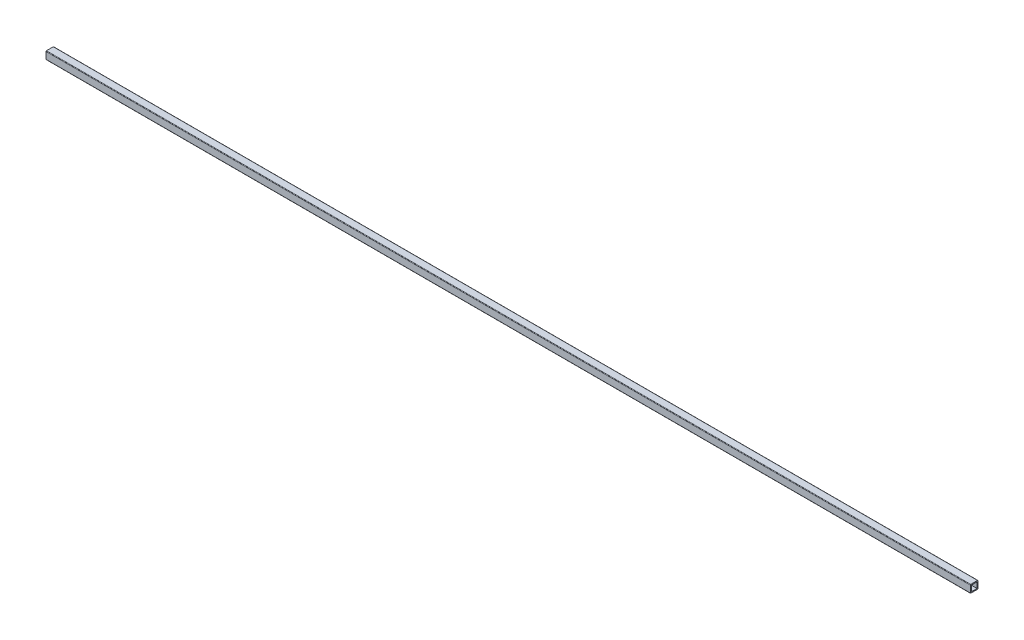
ISO-10303-21;
HEADER;
FILE_DESCRIPTION(('STEP AP214'),'2;1');
FILE_NAME('part.step','',(''),(''),'','','');
FILE_SCHEMA(('AUTOMOTIVE_DESIGN { 1 0 10303 214 1 1 1 1 }'));
ENDSEC;
DATA;
#1=APPLICATION_CONTEXT('core data for automotive mechanical design processes');
#2=APPLICATION_PROTOCOL_DEFINITION('international standard','automotive_design',2000,#1);
#3=PRODUCT_CONTEXT('',#1,'mechanical');
#4=PRODUCT('Part','Part','',(#3));
#5=PRODUCT_RELATED_PRODUCT_CATEGORY('part','',(#4));
#6=PRODUCT_DEFINITION_FORMATION('','',#4);
#7=PRODUCT_DEFINITION_CONTEXT('part definition',#1,'design');
#8=PRODUCT_DEFINITION('design','',#6,#7);
#9=PRODUCT_DEFINITION_SHAPE('','',#8);
#10=(LENGTH_UNIT() NAMED_UNIT(*) SI_UNIT(.MILLI.,.METRE.));
#11=(NAMED_UNIT(*) PLANE_ANGLE_UNIT() SI_UNIT($,.RADIAN.));
#12=(NAMED_UNIT(*) SI_UNIT($,.STERADIAN.) SOLID_ANGLE_UNIT());
#13=UNCERTAINTY_MEASURE_WITH_UNIT(LENGTH_MEASURE(1.E-05),#10,'distance_accuracy_value','');
#14=(GEOMETRIC_REPRESENTATION_CONTEXT(3) GLOBAL_UNCERTAINTY_ASSIGNED_CONTEXT((#13)) GLOBAL_UNIT_ASSIGNED_CONTEXT((#10,
#11,#12)) REPRESENTATION_CONTEXT('',''));
#15=CARTESIAN_POINT('',(0.,0.,0.));
#16=DIRECTION('',(0.,0.,1.));
#17=DIRECTION('',(1.,0.,0.));
#18=AXIS2_PLACEMENT_3D('',#15,#16,#17);
#19=CARTESIAN_POINT('',(1524.,-5.55625,-5.55625));
#20=DIRECTION('',(-1.,0.,0.));
#21=DIRECTION('',(0.,0.,1.));
#22=AXIS2_PLACEMENT_3D('',#19,#20,#21);
#23=CYLINDRICAL_SURFACE('',#22,0.79375);
#24=CARTESIAN_POINT('',(0.,-5.55625,-5.55625));
#25=DIRECTION('',(1.,0.,0.));
#26=DIRECTION('',(0.,0.,-1.));
#27=AXIS2_PLACEMENT_3D('',#24,#25,#26);
#28=CIRCLE('',#27,0.79375);
#29=CARTESIAN_POINT('',(0.,-6.35,-5.55624999999999));
#30=VERTEX_POINT('',#29);
#31=CARTESIAN_POINT('',(0.,-5.55624999999999,-6.35));
#32=VERTEX_POINT('',#31);
#33=EDGE_CURVE('E195',#30,#32,#28,.T.);
#34=ORIENTED_EDGE('',*,*,#33,.T.);
#35=DIRECTION('',(-1.,0.,0.));
#36=VECTOR('',#35,1.);
#37=CARTESIAN_POINT('',(1524.,-5.55624999999999,-6.35));
#38=LINE('',#37,#36);
#39=CARTESIAN_POINT('',(1524.,-5.55624999999999,-6.35));
#40=VERTEX_POINT('',#39);
#41=EDGE_CURVE('E12',#40,#32,#38,.T.);
#42=ORIENTED_EDGE('',*,*,#41,.F.);
#43=CARTESIAN_POINT('',(1524.,-5.55625,-5.55625));
#44=DIRECTION('',(1.,0.,0.));
#45=DIRECTION('',(0.,0.,-1.));
#46=AXIS2_PLACEMENT_3D('',#43,#44,#45);
#47=CIRCLE('',#46,0.79375);
#48=CARTESIAN_POINT('',(1524.,-6.35,-5.55624999999999));
#49=VERTEX_POINT('',#48);
#50=EDGE_CURVE('E248',#49,#40,#47,.T.);
#51=ORIENTED_EDGE('',*,*,#50,.F.);
#52=DIRECTION('',(-1.,0.,0.));
#53=VECTOR('',#52,1.);
#54=CARTESIAN_POINT('',(1524.,-6.35,-5.55624999999999));
#55=LINE('',#54,#53);
#56=EDGE_CURVE('E210',#49,#30,#55,.T.);
#57=ORIENTED_EDGE('',*,*,#56,.T.);
#58=EDGE_LOOP('',(#34,#42,#51,#57));
#59=FACE_BOUND('',#58,.T.);
#60=ADVANCED_FACE('F59',(#59),#23,.T.);
#61=CARTESIAN_POINT('',(1524.,-5.55624999999999,-6.35));
#62=DIRECTION('',(0.,0.,1.));
#63=DIRECTION('',(1.,0.,0.));
#64=AXIS2_PLACEMENT_3D('',#61,#62,#63);
#65=PLANE('',#64);
#66=DIRECTION('',(0.,1.,0.));
#67=VECTOR('',#66,1.);
#68=CARTESIAN_POINT('',(0.,-5.55624999999999,-6.35));
#69=LINE('',#68,#67);
#70=CARTESIAN_POINT('',(0.,5.55625,-6.35));
#71=VERTEX_POINT('',#70);
#72=EDGE_CURVE('E198',#32,#71,#69,.T.);
#73=ORIENTED_EDGE('',*,*,#72,.T.);
#74=DIRECTION('',(-1.,0.,0.));
#75=VECTOR('',#74,1.);
#76=CARTESIAN_POINT('',(1524.,5.55625,-6.35));
#77=LINE('',#76,#75);
#78=CARTESIAN_POINT('',(1524.,5.55625,-6.35));
#79=VERTEX_POINT('',#78);
#80=EDGE_CURVE('E69',#79,#71,#77,.T.);
#81=ORIENTED_EDGE('',*,*,#80,.F.);
#82=DIRECTION('',(0.,1.,0.));
#83=VECTOR('',#82,1.);
#84=CARTESIAN_POINT('',(1524.,-5.55624999999999,-6.35));
#85=LINE('',#84,#83);
#86=EDGE_CURVE('E250',#40,#79,#85,.T.);
#87=ORIENTED_EDGE('',*,*,#86,.F.);
#88=ORIENTED_EDGE('',*,*,#41,.T.);
#89=EDGE_LOOP('',(#73,#81,#87,#88));
#90=FACE_BOUND('',#89,.T.);
#91=ADVANCED_FACE('F285',(#90),#65,.F.);
#92=CARTESIAN_POINT('',(1524.,5.55625,-5.55625));
#93=DIRECTION('',(-1.,0.,0.));
#94=DIRECTION('',(0.,0.,1.));
#95=AXIS2_PLACEMENT_3D('',#92,#93,#94);
#96=CYLINDRICAL_SURFACE('',#95,0.79375);
#97=CARTESIAN_POINT('',(0.,5.55625,-5.55625));
#98=DIRECTION('',(1.,0.,0.));
#99=DIRECTION('',(0.,0.,-1.));
#100=AXIS2_PLACEMENT_3D('',#97,#98,#99);
#101=CIRCLE('',#100,0.79375);
#102=CARTESIAN_POINT('',(0.,6.35,-5.55624999999999));
#103=VERTEX_POINT('',#102);
#104=EDGE_CURVE('E200',#71,#103,#101,.T.);
#105=ORIENTED_EDGE('',*,*,#104,.T.);
#106=DIRECTION('',(-1.,0.,0.));
#107=VECTOR('',#106,1.);
#108=CARTESIAN_POINT('',(1524.,6.35,-5.55624999999999));
#109=LINE('',#108,#107);
#110=CARTESIAN_POINT('',(1524.,6.35,-5.55624999999999));
#111=VERTEX_POINT('',#110);
#112=EDGE_CURVE('E217',#111,#103,#109,.T.);
#113=ORIENTED_EDGE('',*,*,#112,.F.);
#114=CARTESIAN_POINT('',(1524.,5.55625,-5.55625));
#115=DIRECTION('',(1.,0.,0.));
#116=DIRECTION('',(0.,0.,-1.));
#117=AXIS2_PLACEMENT_3D('',#114,#115,#116);
#118=CIRCLE('',#117,0.79375);
#119=EDGE_CURVE('E255',#79,#111,#118,.T.);
#120=ORIENTED_EDGE('',*,*,#119,.F.);
#121=ORIENTED_EDGE('',*,*,#80,.T.);
#122=EDGE_LOOP('',(#105,#113,#120,#121));
#123=FACE_BOUND('',#122,.T.);
#124=ADVANCED_FACE('F290',(#123),#96,.T.);
#125=CARTESIAN_POINT('',(1524.,6.35,5.55625));
#126=DIRECTION('',(0.,-1.,0.));
#127=DIRECTION('',(0.,0.,-1.));
#128=AXIS2_PLACEMENT_3D('',#125,#126,#127);
#129=PLANE('',#128);
#130=DIRECTION('',(0.,0.,1.));
#131=VECTOR('',#130,1.);
#132=CARTESIAN_POINT('',(0.,6.35,5.55625));
#133=LINE('',#132,#131);
#134=CARTESIAN_POINT('',(0.,6.35,5.55625));
#135=VERTEX_POINT('',#134);
#136=EDGE_CURVE('E202',#103,#135,#133,.T.);
#137=ORIENTED_EDGE('',*,*,#136,.T.);
#138=DIRECTION('',(-1.,0.,0.));
#139=VECTOR('',#138,1.);
#140=CARTESIAN_POINT('',(1524.,6.35,5.55625));
#141=LINE('',#140,#139);
#142=CARTESIAN_POINT('',(1524.,6.35,5.55625));
#143=VERTEX_POINT('',#142);
#144=EDGE_CURVE('E214',#143,#135,#141,.T.);
#145=ORIENTED_EDGE('',*,*,#144,.F.);
#146=DIRECTION('',(0.,0.,1.));
#147=VECTOR('',#146,1.);
#148=CARTESIAN_POINT('',(1524.,6.35,5.55625));
#149=LINE('',#148,#147);
#150=EDGE_CURVE('E257',#111,#143,#149,.T.);
#151=ORIENTED_EDGE('',*,*,#150,.F.);
#152=ORIENTED_EDGE('',*,*,#112,.T.);
#153=EDGE_LOOP('',(#137,#145,#151,#152));
#154=FACE_BOUND('',#153,.T.);
#155=ADVANCED_FACE('F263',(#154),#129,.F.);
#156=CARTESIAN_POINT('',(1524.,5.55625,5.55625));
#157=DIRECTION('',(-1.,0.,0.));
#158=DIRECTION('',(0.,0.,1.));
#159=AXIS2_PLACEMENT_3D('',#156,#157,#158);
#160=CYLINDRICAL_SURFACE('',#159,0.79375);
#161=CARTESIAN_POINT('',(0.,5.55625,5.55625));
#162=DIRECTION('',(1.,0.,0.));
#163=DIRECTION('',(0.,0.,1.));
#164=AXIS2_PLACEMENT_3D('',#161,#162,#163);
#165=CIRCLE('',#164,0.79375);
#166=CARTESIAN_POINT('',(0.,5.55624999999999,6.35));
#167=VERTEX_POINT('',#166);
#168=EDGE_CURVE('E204',#135,#167,#165,.T.);
#169=ORIENTED_EDGE('',*,*,#168,.T.);
#170=DIRECTION('',(-1.,0.,0.));
#171=VECTOR('',#170,1.);
#172=CARTESIAN_POINT('',(1524.,5.55624999999999,6.35));
#173=LINE('',#172,#171);
#174=CARTESIAN_POINT('',(1524.,5.55624999999999,6.35));
#175=VERTEX_POINT('',#174);
#176=EDGE_CURVE('E174',#175,#167,#173,.T.);
#177=ORIENTED_EDGE('',*,*,#176,.F.);
#178=CARTESIAN_POINT('',(1524.,5.55625,5.55625));
#179=DIRECTION('',(1.,0.,0.));
#180=DIRECTION('',(0.,0.,1.));
#181=AXIS2_PLACEMENT_3D('',#178,#179,#180);
#182=CIRCLE('',#181,0.79375);
#183=EDGE_CURVE('E165',#143,#175,#182,.T.);
#184=ORIENTED_EDGE('',*,*,#183,.F.);
#185=ORIENTED_EDGE('',*,*,#144,.T.);
#186=EDGE_LOOP('',(#169,#177,#184,#185));
#187=FACE_BOUND('',#186,.T.);
#188=ADVANCED_FACE('F267',(#187),#160,.T.);
#189=CARTESIAN_POINT('',(1524.,-5.55624999999999,6.35));
#190=DIRECTION('',(0.,0.,-1.));
#191=DIRECTION('',(-1.,0.,0.));
#192=AXIS2_PLACEMENT_3D('',#189,#190,#191);
#193=PLANE('',#192);
#194=DIRECTION('',(0.,-1.,0.));
#195=VECTOR('',#194,1.);
#196=CARTESIAN_POINT('',(0.,-5.55624999999999,6.35));
#197=LINE('',#196,#195);
#198=CARTESIAN_POINT('',(0.,-5.55624999999999,6.35));
#199=VERTEX_POINT('',#198);
#200=EDGE_CURVE('E173',#167,#199,#197,.T.);
#201=ORIENTED_EDGE('',*,*,#200,.T.);
#202=DIRECTION('',(-1.,0.,0.));
#203=VECTOR('',#202,1.);
#204=CARTESIAN_POINT('',(1524.,-5.55624999999999,6.35));
#205=LINE('',#204,#203);
#206=CARTESIAN_POINT('',(1524.,-5.55624999999999,6.35));
#207=VERTEX_POINT('',#206);
#208=EDGE_CURVE('E170',#207,#199,#205,.T.);
#209=ORIENTED_EDGE('',*,*,#208,.F.);
#210=DIRECTION('',(0.,-1.,0.));
#211=VECTOR('',#210,1.);
#212=CARTESIAN_POINT('',(1524.,-5.55624999999999,6.35));
#213=LINE('',#212,#211);
#214=EDGE_CURVE('E159',#175,#207,#213,.T.);
#215=ORIENTED_EDGE('',*,*,#214,.F.);
#216=ORIENTED_EDGE('',*,*,#176,.T.);
#217=EDGE_LOOP('',(#201,#209,#215,#216));
#218=FACE_BOUND('',#217,.T.);
#219=ADVANCED_FACE('F171',(#218),#193,.F.);
#220=CARTESIAN_POINT('',(1524.,-5.55625,5.55625));
#221=DIRECTION('',(-1.,0.,0.));
#222=DIRECTION('',(0.,0.,1.));
#223=AXIS2_PLACEMENT_3D('',#220,#221,#222);
#224=CYLINDRICAL_SURFACE('',#223,0.79375);
#225=CARTESIAN_POINT('',(0.,-5.55625,5.55625));
#226=DIRECTION('',(1.,0.,0.));
#227=DIRECTION('',(0.,0.,-1.));
#228=AXIS2_PLACEMENT_3D('',#225,#226,#227);
#229=CIRCLE('',#228,0.79375);
#230=CARTESIAN_POINT('',(0.,-6.35,5.55625));
#231=VERTEX_POINT('',#230);
#232=EDGE_CURVE('E119',#199,#231,#229,.T.);
#233=ORIENTED_EDGE('',*,*,#232,.T.);
#234=DIRECTION('',(-1.,0.,0.));
#235=VECTOR('',#234,1.);
#236=CARTESIAN_POINT('',(1524.,-6.35,5.55625));
#237=LINE('',#236,#235);
#238=CARTESIAN_POINT('',(1524.,-6.35,5.55625));
#239=VERTEX_POINT('',#238);
#240=EDGE_CURVE('E175',#239,#231,#237,.T.);
#241=ORIENTED_EDGE('',*,*,#240,.F.);
#242=CARTESIAN_POINT('',(1524.,-5.55625,5.55625));
#243=DIRECTION('',(1.,0.,0.));
#244=DIRECTION('',(0.,0.,-1.));
#245=AXIS2_PLACEMENT_3D('',#242,#243,#244);
#246=CIRCLE('',#245,0.79375);
#247=EDGE_CURVE('E163',#207,#239,#246,.T.);
#248=ORIENTED_EDGE('',*,*,#247,.F.);
#249=ORIENTED_EDGE('',*,*,#208,.T.);
#250=EDGE_LOOP('',(#233,#241,#248,#249));
#251=FACE_BOUND('',#250,.T.);
#252=ADVANCED_FACE('F177',(#251),#224,.T.);
#253=CARTESIAN_POINT('',(1524.,-4.699,4.699));
#254=DIRECTION('',(0.,0.,-1.));
#255=DIRECTION('',(-1.,0.,0.));
#256=AXIS2_PLACEMENT_3D('',#253,#254,#255);
#257=PLANE('',#256);
#258=DIRECTION('',(0.,-1.,0.));
#259=VECTOR('',#258,1.);
#260=CARTESIAN_POINT('',(0.,-4.699,4.699));
#261=LINE('',#260,#259);
#262=CARTESIAN_POINT('',(0.,4.699,4.699));
#263=VERTEX_POINT('',#262);
#264=CARTESIAN_POINT('',(0.,-4.699,4.699));
#265=VERTEX_POINT('',#264);
#266=EDGE_CURVE('E183',#263,#265,#261,.T.);
#267=ORIENTED_EDGE('',*,*,#266,.F.);
#268=DIRECTION('',(-1.,0.,0.));
#269=VECTOR('',#268,1.);
#270=CARTESIAN_POINT('',(1524.,4.699,4.699));
#271=LINE('',#270,#269);
#272=CARTESIAN_POINT('',(1524.,4.699,4.699));
#273=VERTEX_POINT('',#272);
#274=EDGE_CURVE('E63',#273,#263,#271,.T.);
#275=ORIENTED_EDGE('',*,*,#274,.F.);
#276=DIRECTION('',(0.,-1.,0.));
#277=VECTOR('',#276,1.);
#278=CARTESIAN_POINT('',(1524.,-4.699,4.699));
#279=LINE('',#278,#277);
#280=CARTESIAN_POINT('',(1524.,-4.699,4.699));
#281=VERTEX_POINT('',#280);
#282=EDGE_CURVE('E209',#273,#281,#279,.T.);
#283=ORIENTED_EDGE('',*,*,#282,.T.);
#284=DIRECTION('',(-1.,0.,0.));
#285=VECTOR('',#284,1.);
#286=CARTESIAN_POINT('',(1524.,-4.699,4.699));
#287=LINE('',#286,#285);
#288=EDGE_CURVE('E179',#281,#265,#287,.T.);
#289=ORIENTED_EDGE('',*,*,#288,.T.);
#290=EDGE_LOOP('',(#267,#275,#283,#289));
#291=FACE_BOUND('',#290,.T.);
#292=ADVANCED_FACE('F61',(#291),#257,.T.);
#293=CARTESIAN_POINT('',(1524.,4.699,4.699));
#294=DIRECTION('',(0.,-1.,0.));
#295=DIRECTION('',(0.,0.,-1.));
#296=AXIS2_PLACEMENT_3D('',#293,#294,#295);
#297=PLANE('',#296);
#298=DIRECTION('',(0.,0.,1.));
#299=VECTOR('',#298,1.);
#300=CARTESIAN_POINT('',(0.,4.699,4.699));
#301=LINE('',#300,#299);
#302=CARTESIAN_POINT('',(0.,4.699,-4.699));
#303=VERTEX_POINT('',#302);
#304=EDGE_CURVE('E186',#303,#263,#301,.T.);
#305=ORIENTED_EDGE('',*,*,#304,.F.);
#306=DIRECTION('',(-1.,0.,0.));
#307=VECTOR('',#306,1.);
#308=CARTESIAN_POINT('',(1524.,4.699,-4.699));
#309=LINE('',#308,#307);
#310=CARTESIAN_POINT('',(1524.,4.699,-4.699));
#311=VERTEX_POINT('',#310);
#312=EDGE_CURVE('E224',#311,#303,#309,.T.);
#313=ORIENTED_EDGE('',*,*,#312,.F.);
#314=DIRECTION('',(0.,0.,1.));
#315=VECTOR('',#314,1.);
#316=CARTESIAN_POINT('',(1524.,4.699,4.699));
#317=LINE('',#316,#315);
#318=EDGE_CURVE('E233',#311,#273,#317,.T.);
#319=ORIENTED_EDGE('',*,*,#318,.T.);
#320=ORIENTED_EDGE('',*,*,#274,.T.);
#321=EDGE_LOOP('',(#305,#313,#319,#320));
#322=FACE_BOUND('',#321,.T.);
#323=ADVANCED_FACE('F231',(#322),#297,.T.);
#324=CARTESIAN_POINT('',(1524.,-4.699,-4.699));
#325=DIRECTION('',(0.,0.,1.));
#326=DIRECTION('',(0.,-1.,0.));
#327=AXIS2_PLACEMENT_3D('',#324,#325,#326);
#328=PLANE('',#327);
#329=DIRECTION('',(0.,1.,0.));
#330=VECTOR('',#329,1.);
#331=CARTESIAN_POINT('',(0.,-4.699,-4.699));
#332=LINE('',#331,#330);
#333=CARTESIAN_POINT('',(0.,-4.699,-4.699));
#334=VERTEX_POINT('',#333);
#335=EDGE_CURVE('E189',#334,#303,#332,.T.);
#336=ORIENTED_EDGE('',*,*,#335,.F.);
#337=DIRECTION('',(-1.,0.,0.));
#338=VECTOR('',#337,1.);
#339=CARTESIAN_POINT('',(1524.,-4.699,-4.699));
#340=LINE('',#339,#338);
#341=CARTESIAN_POINT('',(1524.,-4.699,-4.699));
#342=VERTEX_POINT('',#341);
#343=EDGE_CURVE('E223',#342,#334,#340,.T.);
#344=ORIENTED_EDGE('',*,*,#343,.F.);
#345=DIRECTION('',(0.,1.,0.));
#346=VECTOR('',#345,1.);
#347=CARTESIAN_POINT('',(1524.,-4.699,-4.699));
#348=LINE('',#347,#346);
#349=EDGE_CURVE('E240',#342,#311,#348,.T.);
#350=ORIENTED_EDGE('',*,*,#349,.T.);
#351=ORIENTED_EDGE('',*,*,#312,.T.);
#352=EDGE_LOOP('',(#336,#344,#350,#351));
#353=FACE_BOUND('',#352,.T.);
#354=ADVANCED_FACE('F238',(#353),#328,.T.);
#355=CARTESIAN_POINT('',(1524.,-4.699,4.699));
#356=DIRECTION('',(0.,1.,0.));
#357=DIRECTION('',(0.,0.,1.));
#358=AXIS2_PLACEMENT_3D('',#355,#356,#357);
#359=PLANE('',#358);
#360=DIRECTION('',(0.,0.,-1.));
#361=VECTOR('',#360,1.);
#362=CARTESIAN_POINT('',(0.,-4.699,4.699));
#363=LINE('',#362,#361);
#364=EDGE_CURVE('E192',#265,#334,#363,.T.);
#365=ORIENTED_EDGE('',*,*,#364,.F.);
#366=ORIENTED_EDGE('',*,*,#288,.F.);
#367=DIRECTION('',(0.,0.,-1.));
#368=VECTOR('',#367,1.);
#369=CARTESIAN_POINT('',(1524.,-4.699,4.699));
#370=LINE('',#369,#368);
#371=EDGE_CURVE('E245',#281,#342,#370,.T.);
#372=ORIENTED_EDGE('',*,*,#371,.T.);
#373=ORIENTED_EDGE('',*,*,#343,.T.);
#374=EDGE_LOOP('',(#365,#366,#372,#373));
#375=FACE_BOUND('',#374,.T.);
#376=ADVANCED_FACE('F247',(#375),#359,.T.);
#377=CARTESIAN_POINT('',(1524.,-6.35,5.55625));
#378=DIRECTION('',(0.,1.,0.));
#379=DIRECTION('',(0.,0.,1.));
#380=AXIS2_PLACEMENT_3D('',#377,#378,#379);
#381=PLANE('',#380);
#382=DIRECTION('',(0.,0.,-1.));
#383=VECTOR('',#382,1.);
#384=CARTESIAN_POINT('',(0.,-6.35,5.55625));
#385=LINE('',#384,#383);
#386=EDGE_CURVE('E125',#231,#30,#385,.T.);
#387=ORIENTED_EDGE('',*,*,#386,.T.);
#388=ORIENTED_EDGE('',*,*,#56,.F.);
#389=DIRECTION('',(0.,0.,-1.));
#390=VECTOR('',#389,1.);
#391=CARTESIAN_POINT('',(1524.,-6.35,5.55625));
#392=LINE('',#391,#390);
#393=EDGE_CURVE('E78',#239,#49,#392,.T.);
#394=ORIENTED_EDGE('',*,*,#393,.F.);
#395=ORIENTED_EDGE('',*,*,#240,.T.);
#396=EDGE_LOOP('',(#387,#388,#394,#395));
#397=FACE_BOUND('',#396,.T.);
#398=ADVANCED_FACE('F273',(#397),#381,.F.);
#399=CARTESIAN_POINT('',(1524.,-5.55625,-5.55625));
#400=DIRECTION('',(1.,0.,0.));
#401=DIRECTION('',(0.,0.,-1.));
#402=AXIS2_PLACEMENT_3D('',#399,#400,#401);
#403=PLANE('',#402);
#404=ORIENTED_EDGE('',*,*,#282,.F.);
#405=ORIENTED_EDGE('',*,*,#318,.F.);
#406=ORIENTED_EDGE('',*,*,#349,.F.);
#407=ORIENTED_EDGE('',*,*,#371,.F.);
#408=EDGE_LOOP('',(#404,#405,#406,#407));
#409=FACE_BOUND('',#408,.T.);
#410=ORIENTED_EDGE('',*,*,#50,.T.);
#411=ORIENTED_EDGE('',*,*,#86,.T.);
#412=ORIENTED_EDGE('',*,*,#119,.T.);
#413=ORIENTED_EDGE('',*,*,#150,.T.);
#414=ORIENTED_EDGE('',*,*,#183,.T.);
#415=ORIENTED_EDGE('',*,*,#214,.T.);
#416=ORIENTED_EDGE('',*,*,#247,.T.);
#417=ORIENTED_EDGE('',*,*,#393,.T.);
#418=EDGE_LOOP('',(#410,#411,#412,#413,#414,#415,#416,#417));
#419=FACE_BOUND('',#418,.T.);
#420=ADVANCED_FACE('F161',(#409,#419),#403,.T.);
#421=CARTESIAN_POINT('',(0.,-5.55625,-5.55625));
#422=DIRECTION('',(1.,0.,0.));
#423=DIRECTION('',(0.,0.,-1.));
#424=AXIS2_PLACEMENT_3D('',#421,#422,#423);
#425=PLANE('',#424);
#426=ORIENTED_EDGE('',*,*,#266,.T.);
#427=ORIENTED_EDGE('',*,*,#364,.T.);
#428=ORIENTED_EDGE('',*,*,#335,.T.);
#429=ORIENTED_EDGE('',*,*,#304,.T.);
#430=EDGE_LOOP('',(#426,#427,#428,#429));
#431=FACE_BOUND('',#430,.T.);
#432=ORIENTED_EDGE('',*,*,#33,.F.);
#433=ORIENTED_EDGE('',*,*,#386,.F.);
#434=ORIENTED_EDGE('',*,*,#232,.F.);
#435=ORIENTED_EDGE('',*,*,#200,.F.);
#436=ORIENTED_EDGE('',*,*,#168,.F.);
#437=ORIENTED_EDGE('',*,*,#136,.F.);
#438=ORIENTED_EDGE('',*,*,#104,.F.);
#439=ORIENTED_EDGE('',*,*,#72,.F.);
#440=EDGE_LOOP('',(#432,#433,#434,#435,#436,#437,#438,#439));
#441=FACE_BOUND('',#440,.T.);
#442=ADVANCED_FACE('F236',(#431,#441),#425,.F.);
#443=CLOSED_SHELL('',(#60,#91,#124,#155,#188,#219,#252,#292,#323,#354,#376,#398,#420,#442));
#444=MANIFOLD_SOLID_BREP('B2',#443);
#445=ADVANCED_BREP_SHAPE_REPRESENTATION('',(#18,#444),#14);
#446=SHAPE_DEFINITION_REPRESENTATION(#9,#445);
ENDSEC;
END-ISO-10303-21;
